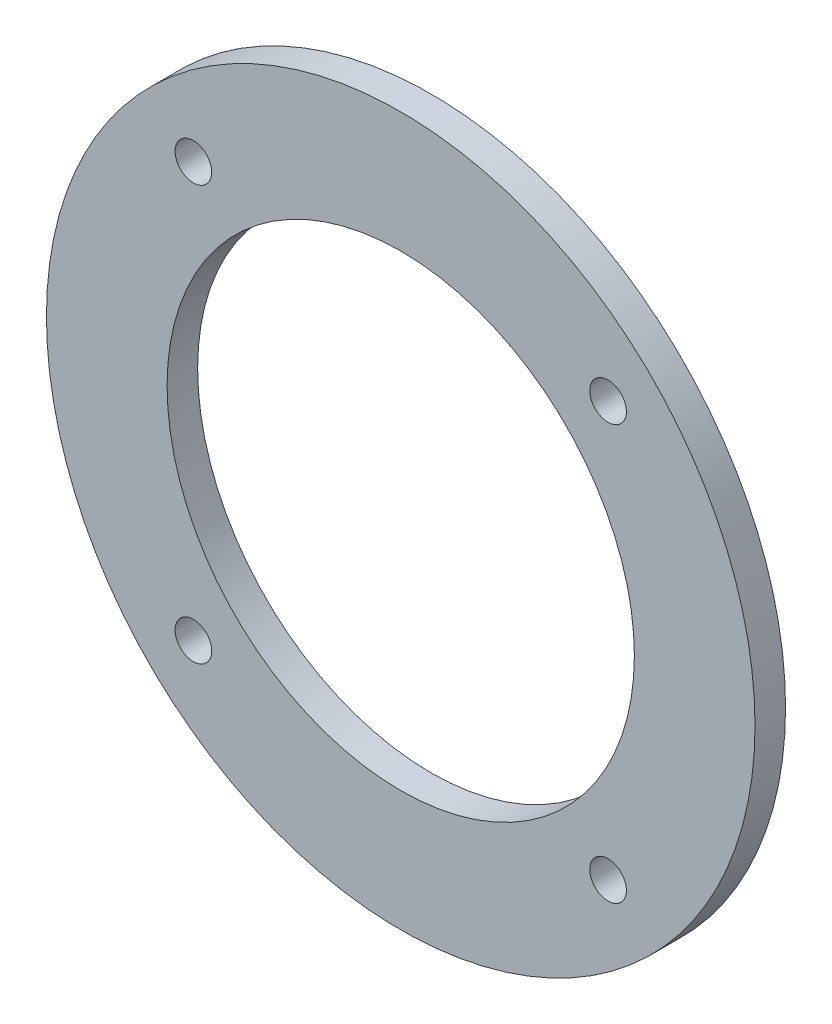
ISO-10303-21;
HEADER;
FILE_DESCRIPTION(('STEP AP214'),'2;1');
FILE_NAME('part.step','',(''),(''),'','','');
FILE_SCHEMA(('AUTOMOTIVE_DESIGN { 1 0 10303 214 1 1 1 1 }'));
ENDSEC;
DATA;
#1=APPLICATION_CONTEXT('core data for automotive mechanical design processes');
#2=APPLICATION_PROTOCOL_DEFINITION('international standard','automotive_design',2000,#1);
#3=PRODUCT_CONTEXT('',#1,'mechanical');
#4=PRODUCT('Part','Part','',(#3));
#5=PRODUCT_RELATED_PRODUCT_CATEGORY('part','',(#4));
#6=PRODUCT_DEFINITION_FORMATION('','',#4);
#7=PRODUCT_DEFINITION_CONTEXT('part definition',#1,'design');
#8=PRODUCT_DEFINITION('design','',#6,#7);
#9=PRODUCT_DEFINITION_SHAPE('','',#8);
#10=(LENGTH_UNIT() NAMED_UNIT(*) SI_UNIT(.MILLI.,.METRE.));
#11=(NAMED_UNIT(*) PLANE_ANGLE_UNIT() SI_UNIT($,.RADIAN.));
#12=(NAMED_UNIT(*) SI_UNIT($,.STERADIAN.) SOLID_ANGLE_UNIT());
#13=UNCERTAINTY_MEASURE_WITH_UNIT(LENGTH_MEASURE(1.E-05),#10,'distance_accuracy_value','');
#14=(GEOMETRIC_REPRESENTATION_CONTEXT(3) GLOBAL_UNCERTAINTY_ASSIGNED_CONTEXT((#13)) GLOBAL_UNIT_ASSIGNED_CONTEXT((#10,
#11,#12)) REPRESENTATION_CONTEXT('',''));
#15=CARTESIAN_POINT('',(0.,0.,0.));
#16=DIRECTION('',(0.,0.,1.));
#17=DIRECTION('',(1.,0.,0.));
#18=AXIS2_PLACEMENT_3D('',#15,#16,#17);
#19=CARTESIAN_POINT('',(0.,0.,5.));
#20=DIRECTION('',(0.,0.,1.));
#21=DIRECTION('',(1.,0.,0.));
#22=AXIS2_PLACEMENT_3D('',#19,#20,#21);
#23=PLANE('',#22);
#24=CARTESIAN_POINT('',(-33.9411254969542,-33.9411254969544,5.));
#25=DIRECTION('',(0.,0.,1.));
#26=DIRECTION('',(1.,0.,0.));
#27=AXIS2_PLACEMENT_3D('',#24,#25,#26);
#28=CIRCLE('',#27,3.);
#29=CARTESIAN_POINT('',(-30.9411254969542,-33.9411254969544,5.));
#30=VERTEX_POINT('',#29);
#31=EDGE_CURVE('E59',#30,#30,#28,.T.);
#32=ORIENTED_EDGE('',*,*,#31,.F.);
#33=EDGE_LOOP('',(#32));
#34=FACE_BOUND('',#33,.T.);
#35=CARTESIAN_POINT('',(33.9411254969542,33.9411254969543,5.));
#36=DIRECTION('',(0.,0.,1.));
#37=DIRECTION('',(1.,0.,0.));
#38=AXIS2_PLACEMENT_3D('',#35,#36,#37);
#39=CIRCLE('',#38,3.);
#40=CARTESIAN_POINT('',(36.9411254969542,33.9411254969543,5.));
#41=VERTEX_POINT('',#40);
#42=EDGE_CURVE('E47',#41,#41,#39,.T.);
#43=ORIENTED_EDGE('',*,*,#42,.F.);
#44=EDGE_LOOP('',(#43));
#45=FACE_BOUND('',#44,.T.);
#46=CARTESIAN_POINT('',(0.,0.,5.));
#47=DIRECTION('',(0.,0.,1.));
#48=DIRECTION('',(1.,0.,0.));
#49=AXIS2_PLACEMENT_3D('',#46,#47,#48);
#50=CIRCLE('',#49,58.);
#51=CARTESIAN_POINT('',(58.,0.,5.));
#52=VERTEX_POINT('',#51);
#53=EDGE_CURVE('E10',#52,#52,#50,.T.);
#54=ORIENTED_EDGE('',*,*,#53,.T.);
#55=EDGE_LOOP('',(#54));
#56=FACE_BOUND('',#55,.T.);
#57=CARTESIAN_POINT('',(0.,0.,5.));
#58=DIRECTION('',(0.,0.,1.));
#59=DIRECTION('',(1.,0.,0.));
#60=AXIS2_PLACEMENT_3D('',#57,#58,#59);
#61=CIRCLE('',#60,38.25);
#62=CARTESIAN_POINT('',(38.25,0.,5.));
#63=VERTEX_POINT('',#62);
#64=EDGE_CURVE('E42',#63,#63,#61,.T.);
#65=ORIENTED_EDGE('',*,*,#64,.F.);
#66=EDGE_LOOP('',(#65));
#67=FACE_BOUND('',#66,.T.);
#68=CARTESIAN_POINT('',(33.9411254969543,-33.9411254969542,5.));
#69=DIRECTION('',(0.,0.,1.));
#70=DIRECTION('',(1.,0.,0.));
#71=AXIS2_PLACEMENT_3D('',#68,#69,#70);
#72=CIRCLE('',#71,3.);
#73=CARTESIAN_POINT('',(36.9411254969543,-33.9411254969542,5.));
#74=VERTEX_POINT('',#73);
#75=EDGE_CURVE('E53',#74,#74,#72,.T.);
#76=ORIENTED_EDGE('',*,*,#75,.F.);
#77=EDGE_LOOP('',(#76));
#78=FACE_BOUND('',#77,.T.);
#79=CARTESIAN_POINT('',(-33.9411254969544,33.9411254969542,5.));
#80=DIRECTION('',(0.,0.,1.));
#81=DIRECTION('',(1.,0.,0.));
#82=AXIS2_PLACEMENT_3D('',#79,#80,#81);
#83=CIRCLE('',#82,3.);
#84=CARTESIAN_POINT('',(-30.9411254969543,33.9411254969542,5.));
#85=VERTEX_POINT('',#84);
#86=EDGE_CURVE('E65',#85,#85,#83,.T.);
#87=ORIENTED_EDGE('',*,*,#86,.F.);
#88=EDGE_LOOP('',(#87));
#89=FACE_BOUND('',#88,.T.);
#90=ADVANCED_FACE('F31',(#34,#45,#56,#67,#78,#89),#23,.T.);
#91=CARTESIAN_POINT('',(0.,0.,0.));
#92=DIRECTION('',(0.,0.,1.));
#93=DIRECTION('',(1.,0.,0.));
#94=AXIS2_PLACEMENT_3D('',#91,#92,#93);
#95=PLANE('',#94);
#96=CARTESIAN_POINT('',(0.,0.,0.));
#97=DIRECTION('',(0.,0.,1.));
#98=DIRECTION('',(1.,0.,0.));
#99=AXIS2_PLACEMENT_3D('',#96,#97,#98);
#100=CIRCLE('',#99,58.);
#101=CARTESIAN_POINT('',(58.,0.,0.));
#102=VERTEX_POINT('',#101);
#103=EDGE_CURVE('E35',#102,#102,#100,.T.);
#104=ORIENTED_EDGE('',*,*,#103,.F.);
#105=EDGE_LOOP('',(#104));
#106=FACE_BOUND('',#105,.T.);
#107=CARTESIAN_POINT('',(0.,0.,0.));
#108=DIRECTION('',(0.,0.,1.));
#109=DIRECTION('',(1.,0.,0.));
#110=AXIS2_PLACEMENT_3D('',#107,#108,#109);
#111=CIRCLE('',#110,38.25);
#112=CARTESIAN_POINT('',(38.25,0.,0.));
#113=VERTEX_POINT('',#112);
#114=EDGE_CURVE('E44',#113,#113,#111,.T.);
#115=ORIENTED_EDGE('',*,*,#114,.T.);
#116=EDGE_LOOP('',(#115));
#117=FACE_BOUND('',#116,.T.);
#118=CARTESIAN_POINT('',(33.9411254969542,33.9411254969543,0.));
#119=DIRECTION('',(0.,0.,1.));
#120=DIRECTION('',(1.,0.,0.));
#121=AXIS2_PLACEMENT_3D('',#118,#119,#120);
#122=CIRCLE('',#121,3.);
#123=CARTESIAN_POINT('',(36.9411254969542,33.9411254969543,0.));
#124=VERTEX_POINT('',#123);
#125=EDGE_CURVE('E50',#124,#124,#122,.T.);
#126=ORIENTED_EDGE('',*,*,#125,.T.);
#127=EDGE_LOOP('',(#126));
#128=FACE_BOUND('',#127,.T.);
#129=CARTESIAN_POINT('',(33.9411254969543,-33.9411254969542,0.));
#130=DIRECTION('',(0.,0.,1.));
#131=DIRECTION('',(1.,0.,0.));
#132=AXIS2_PLACEMENT_3D('',#129,#130,#131);
#133=CIRCLE('',#132,3.);
#134=CARTESIAN_POINT('',(36.9411254969543,-33.9411254969542,0.));
#135=VERTEX_POINT('',#134);
#136=EDGE_CURVE('E56',#135,#135,#133,.T.);
#137=ORIENTED_EDGE('',*,*,#136,.T.);
#138=EDGE_LOOP('',(#137));
#139=FACE_BOUND('',#138,.T.);
#140=CARTESIAN_POINT('',(-33.9411254969542,-33.9411254969544,0.));
#141=DIRECTION('',(0.,0.,1.));
#142=DIRECTION('',(1.,0.,0.));
#143=AXIS2_PLACEMENT_3D('',#140,#141,#142);
#144=CIRCLE('',#143,3.);
#145=CARTESIAN_POINT('',(-30.9411254969542,-33.9411254969544,0.));
#146=VERTEX_POINT('',#145);
#147=EDGE_CURVE('E62',#146,#146,#144,.T.);
#148=ORIENTED_EDGE('',*,*,#147,.T.);
#149=EDGE_LOOP('',(#148));
#150=FACE_BOUND('',#149,.T.);
#151=CARTESIAN_POINT('',(-33.9411254969544,33.9411254969542,0.));
#152=DIRECTION('',(0.,0.,1.));
#153=DIRECTION('',(1.,0.,0.));
#154=AXIS2_PLACEMENT_3D('',#151,#152,#153);
#155=CIRCLE('',#154,3.);
#156=CARTESIAN_POINT('',(-30.9411254969543,33.9411254969542,0.));
#157=VERTEX_POINT('',#156);
#158=EDGE_CURVE('E68',#157,#157,#155,.T.);
#159=ORIENTED_EDGE('',*,*,#158,.T.);
#160=EDGE_LOOP('',(#159));
#161=FACE_BOUND('',#160,.T.);
#162=ADVANCED_FACE('F78',(#106,#117,#128,#139,#150,#161),#95,.F.);
#163=CARTESIAN_POINT('',(0.,0.,5.));
#164=DIRECTION('',(0.,0.,-1.));
#165=DIRECTION('',(-1.,0.,0.));
#166=AXIS2_PLACEMENT_3D('',#163,#164,#165);
#167=CYLINDRICAL_SURFACE('',#166,58.);
#168=ORIENTED_EDGE('',*,*,#53,.F.);
#169=EDGE_LOOP('',(#168));
#170=FACE_BOUND('',#169,.T.);
#171=ORIENTED_EDGE('',*,*,#103,.T.);
#172=EDGE_LOOP('',(#171));
#173=FACE_BOUND('',#172,.T.);
#174=ADVANCED_FACE('F33',(#170,#173),#167,.T.);
#175=CARTESIAN_POINT('',(0.,0.,5.));
#176=DIRECTION('',(0.,0.,-1.));
#177=DIRECTION('',(-1.,0.,0.));
#178=AXIS2_PLACEMENT_3D('',#175,#176,#177);
#179=CYLINDRICAL_SURFACE('',#178,38.25);
#180=ORIENTED_EDGE('',*,*,#64,.T.);
#181=EDGE_LOOP('',(#180));
#182=FACE_BOUND('',#181,.T.);
#183=ORIENTED_EDGE('',*,*,#114,.F.);
#184=EDGE_LOOP('',(#183));
#185=FACE_BOUND('',#184,.T.);
#186=ADVANCED_FACE('F88',(#182,#185),#179,.F.);
#187=CARTESIAN_POINT('',(33.9411254969542,33.9411254969543,5.));
#188=DIRECTION('',(0.,0.,-1.));
#189=DIRECTION('',(-1.,0.,0.));
#190=AXIS2_PLACEMENT_3D('',#187,#188,#189);
#191=CYLINDRICAL_SURFACE('',#190,3.);
#192=ORIENTED_EDGE('',*,*,#42,.T.);
#193=EDGE_LOOP('',(#192));
#194=FACE_BOUND('',#193,.T.);
#195=ORIENTED_EDGE('',*,*,#125,.F.);
#196=EDGE_LOOP('',(#195));
#197=FACE_BOUND('',#196,.T.);
#198=ADVANCED_FACE('F91',(#194,#197),#191,.F.);
#199=CARTESIAN_POINT('',(33.9411254969543,-33.9411254969542,5.));
#200=DIRECTION('',(0.,0.,-1.));
#201=DIRECTION('',(-1.,0.,0.));
#202=AXIS2_PLACEMENT_3D('',#199,#200,#201);
#203=CYLINDRICAL_SURFACE('',#202,3.);
#204=ORIENTED_EDGE('',*,*,#75,.T.);
#205=EDGE_LOOP('',(#204));
#206=FACE_BOUND('',#205,.T.);
#207=ORIENTED_EDGE('',*,*,#136,.F.);
#208=EDGE_LOOP('',(#207));
#209=FACE_BOUND('',#208,.T.);
#210=ADVANCED_FACE('F95',(#206,#209),#203,.F.);
#211=CARTESIAN_POINT('',(-33.9411254969542,-33.9411254969544,5.));
#212=DIRECTION('',(0.,0.,-1.));
#213=DIRECTION('',(-1.,0.,0.));
#214=AXIS2_PLACEMENT_3D('',#211,#212,#213);
#215=CYLINDRICAL_SURFACE('',#214,3.);
#216=ORIENTED_EDGE('',*,*,#31,.T.);
#217=EDGE_LOOP('',(#216));
#218=FACE_BOUND('',#217,.T.);
#219=ORIENTED_EDGE('',*,*,#147,.F.);
#220=EDGE_LOOP('',(#219));
#221=FACE_BOUND('',#220,.T.);
#222=ADVANCED_FACE('F99',(#218,#221),#215,.F.);
#223=CARTESIAN_POINT('',(-33.9411254969544,33.9411254969542,5.));
#224=DIRECTION('',(0.,0.,-1.));
#225=DIRECTION('',(-1.,0.,0.));
#226=AXIS2_PLACEMENT_3D('',#223,#224,#225);
#227=CYLINDRICAL_SURFACE('',#226,3.);
#228=ORIENTED_EDGE('',*,*,#86,.T.);
#229=EDGE_LOOP('',(#228));
#230=FACE_BOUND('',#229,.T.);
#231=ORIENTED_EDGE('',*,*,#158,.F.);
#232=EDGE_LOOP('',(#231));
#233=FACE_BOUND('',#232,.T.);
#234=ADVANCED_FACE('F74',(#230,#233),#227,.F.);
#235=CLOSED_SHELL('',(#90,#162,#174,#186,#198,#210,#222,#234));
#236=MANIFOLD_SOLID_BREP('B2',#235);
#237=ADVANCED_BREP_SHAPE_REPRESENTATION('',(#18,#236),#14);
#238=SHAPE_DEFINITION_REPRESENTATION(#9,#237);
ENDSEC;
END-ISO-10303-21;
